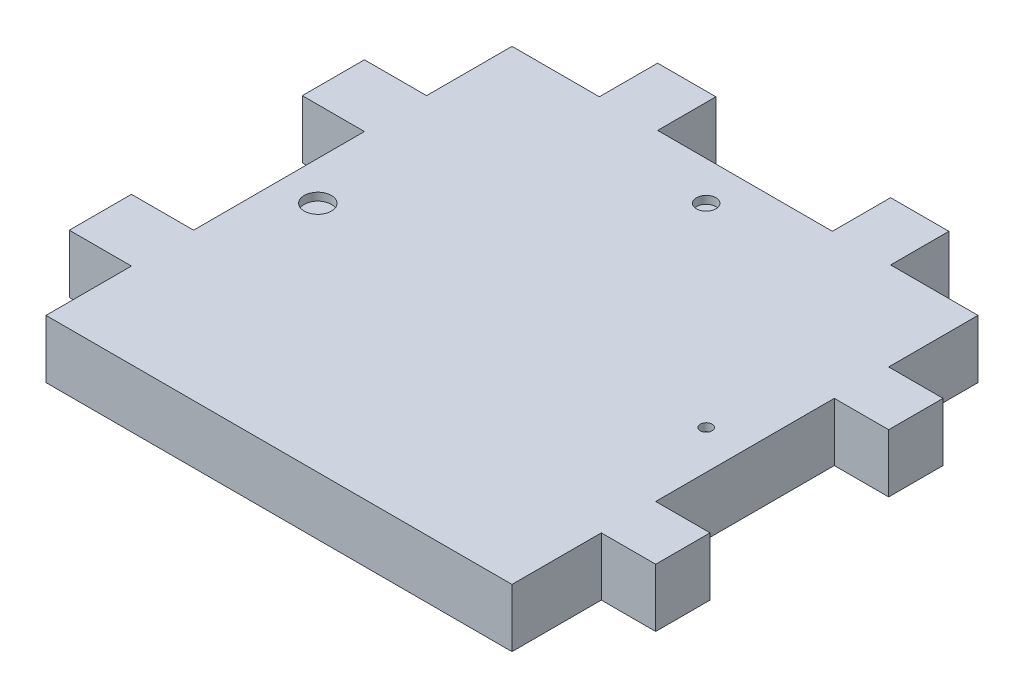
ISO-10303-21;
HEADER;
FILE_DESCRIPTION(('STEP AP214'),'2;1');
FILE_NAME('part.step','',(''),(''),'','','');
FILE_SCHEMA(('AUTOMOTIVE_DESIGN { 1 0 10303 214 1 1 1 1 }'));
ENDSEC;
DATA;
#1=APPLICATION_CONTEXT('core data for automotive mechanical design processes');
#2=APPLICATION_PROTOCOL_DEFINITION('international standard','automotive_design',2000,#1);
#3=PRODUCT_CONTEXT('',#1,'mechanical');
#4=PRODUCT('Part','Part','',(#3));
#5=PRODUCT_RELATED_PRODUCT_CATEGORY('part','',(#4));
#6=PRODUCT_DEFINITION_FORMATION('','',#4);
#7=PRODUCT_DEFINITION_CONTEXT('part definition',#1,'design');
#8=PRODUCT_DEFINITION('design','',#6,#7);
#9=PRODUCT_DEFINITION_SHAPE('','',#8);
#10=(LENGTH_UNIT() NAMED_UNIT(*) SI_UNIT(.MILLI.,.METRE.));
#11=(NAMED_UNIT(*) PLANE_ANGLE_UNIT() SI_UNIT($,.RADIAN.));
#12=(NAMED_UNIT(*) SI_UNIT($,.STERADIAN.) SOLID_ANGLE_UNIT());
#13=UNCERTAINTY_MEASURE_WITH_UNIT(LENGTH_MEASURE(1.E-05),#10,'distance_accuracy_value','');
#14=(GEOMETRIC_REPRESENTATION_CONTEXT(3) GLOBAL_UNCERTAINTY_ASSIGNED_CONTEXT((#13)) GLOBAL_UNIT_ASSIGNED_CONTEXT((#10,
#11,#12)) REPRESENTATION_CONTEXT('',''));
#15=CARTESIAN_POINT('',(0.,0.,0.));
#16=DIRECTION('',(0.,0.,1.));
#17=DIRECTION('',(1.,0.,0.));
#18=AXIS2_PLACEMENT_3D('',#15,#16,#17);
#19=CARTESIAN_POINT('',(0.,19.05,-76.1999999999998));
#20=DIRECTION('',(0.,0.,1.));
#21=DIRECTION('',(1.,0.,0.));
#22=AXIS2_PLACEMENT_3D('',#19,#20,#21);
#23=PLANE('',#22);
#24=DIRECTION('',(-1.,0.,0.));
#25=VECTOR('',#24,1.);
#26=CARTESIAN_POINT('',(0.,0.,-76.1999999999998));
#27=LINE('',#26,#25);
#28=CARTESIAN_POINT('',(76.1999999999998,0.,-76.1999999999998));
#29=VERTEX_POINT('',#28);
#30=CARTESIAN_POINT('',(47.625,0.,-76.1999999999998));
#31=VERTEX_POINT('',#30);
#32=EDGE_CURVE('E261',#29,#31,#27,.T.);
#33=ORIENTED_EDGE('',*,*,#32,.T.);
#34=DIRECTION('',(0.,-1.,0.));
#35=VECTOR('',#34,1.);
#36=CARTESIAN_POINT('',(47.625,19.05,-76.1999999999998));
#37=LINE('',#36,#35);
#38=CARTESIAN_POINT('',(47.625,19.05,-76.1999999999998));
#39=VERTEX_POINT('',#38);
#40=EDGE_CURVE('E11',#39,#31,#37,.T.);
#41=ORIENTED_EDGE('',*,*,#40,.F.);
#42=DIRECTION('',(-1.,0.,0.));
#43=VECTOR('',#42,1.);
#44=CARTESIAN_POINT('',(0.,19.05,-76.1999999999998));
#45=LINE('',#44,#43);
#46=CARTESIAN_POINT('',(76.1999999999998,19.05,-76.1999999999998));
#47=VERTEX_POINT('',#46);
#48=EDGE_CURVE('E400',#47,#39,#45,.T.);
#49=ORIENTED_EDGE('',*,*,#48,.F.);
#50=DIRECTION('',(0.,-1.,0.));
#51=VECTOR('',#50,1.);
#52=CARTESIAN_POINT('',(76.1999999999998,19.05,-76.1999999999998));
#53=LINE('',#52,#51);
#54=EDGE_CURVE('E58',#47,#29,#53,.T.);
#55=ORIENTED_EDGE('',*,*,#54,.T.);
#56=EDGE_LOOP('',(#33,#41,#49,#55));
#57=FACE_BOUND('',#56,.T.);
#58=ADVANCED_FACE('F41',(#57),#23,.F.);
#59=CARTESIAN_POINT('',(47.625,19.05,0.));
#60=DIRECTION('',(-1.,0.,0.));
#61=DIRECTION('',(0.,0.,1.));
#62=AXIS2_PLACEMENT_3D('',#59,#60,#61);
#63=PLANE('',#62);
#64=DIRECTION('',(0.,0.,-1.));
#65=VECTOR('',#64,1.);
#66=CARTESIAN_POINT('',(47.625,0.,0.));
#67=LINE('',#66,#65);
#68=CARTESIAN_POINT('',(47.625,0.,-95.2499999999998));
#69=VERTEX_POINT('',#68);
#70=EDGE_CURVE('E263',#31,#69,#67,.T.);
#71=ORIENTED_EDGE('',*,*,#70,.T.);
#72=DIRECTION('',(0.,-1.,0.));
#73=VECTOR('',#72,1.);
#74=CARTESIAN_POINT('',(47.625,19.05,-95.2499999999998));
#75=LINE('',#74,#73);
#76=CARTESIAN_POINT('',(47.625,19.05,-95.2499999999998));
#77=VERTEX_POINT('',#76);
#78=EDGE_CURVE('E50',#77,#69,#75,.T.);
#79=ORIENTED_EDGE('',*,*,#78,.F.);
#80=DIRECTION('',(0.,0.,-1.));
#81=VECTOR('',#80,1.);
#82=CARTESIAN_POINT('',(47.625,19.05,0.));
#83=LINE('',#82,#81);
#84=EDGE_CURVE('E156',#39,#77,#83,.T.);
#85=ORIENTED_EDGE('',*,*,#84,.F.);
#86=ORIENTED_EDGE('',*,*,#40,.T.);
#87=EDGE_LOOP('',(#71,#79,#85,#86));
#88=FACE_BOUND('',#87,.T.);
#89=ADVANCED_FACE('F43',(#88),#63,.F.);
#90=CARTESIAN_POINT('',(7.63278329429797E-13,19.05,-95.2500000000002));
#91=DIRECTION('',(0.,0.,-1.));
#92=DIRECTION('',(-1.,0.,0.));
#93=AXIS2_PLACEMENT_3D('',#90,#91,#92);
#94=PLANE('',#93);
#95=DIRECTION('',(1.,0.,0.));
#96=VECTOR('',#95,1.);
#97=CARTESIAN_POINT('',(7.63278329429797E-13,0.,-95.2500000000002));
#98=LINE('',#97,#96);
#99=CARTESIAN_POINT('',(28.575,0.,-95.25));
#100=VERTEX_POINT('',#99);
#101=EDGE_CURVE('E269',#100,#69,#98,.T.);
#102=ORIENTED_EDGE('',*,*,#101,.F.);
#103=DIRECTION('',(0.,-1.,0.));
#104=VECTOR('',#103,1.);
#105=CARTESIAN_POINT('',(28.575,19.05,-95.25));
#106=LINE('',#105,#104);
#107=CARTESIAN_POINT('',(28.575,19.05,-95.25));
#108=VERTEX_POINT('',#107);
#109=EDGE_CURVE('E378',#108,#100,#106,.T.);
#110=ORIENTED_EDGE('',*,*,#109,.F.);
#111=DIRECTION('',(1.,0.,0.));
#112=VECTOR('',#111,1.);
#113=CARTESIAN_POINT('',(7.63278329429797E-13,19.05,-95.2500000000002));
#114=LINE('',#113,#112);
#115=EDGE_CURVE('E384',#108,#77,#114,.T.);
#116=ORIENTED_EDGE('',*,*,#115,.T.);
#117=ORIENTED_EDGE('',*,*,#78,.T.);
#118=EDGE_LOOP('',(#102,#110,#116,#117));
#119=FACE_BOUND('',#118,.T.);
#120=ADVANCED_FACE('F382',(#119),#94,.T.);
#121=CARTESIAN_POINT('',(28.575,19.05,0.));
#122=DIRECTION('',(-1.,0.,0.));
#123=DIRECTION('',(0.,0.,1.));
#124=AXIS2_PLACEMENT_3D('',#121,#122,#123);
#125=PLANE('',#124);
#126=DIRECTION('',(0.,0.,-1.));
#127=VECTOR('',#126,1.);
#128=CARTESIAN_POINT('',(28.575,0.,0.));
#129=LINE('',#128,#127);
#130=CARTESIAN_POINT('',(28.575,0.,-76.1999999999998));
#131=VERTEX_POINT('',#130);
#132=EDGE_CURVE('E272',#131,#100,#129,.T.);
#133=ORIENTED_EDGE('',*,*,#132,.F.);
#134=DIRECTION('',(0.,-1.,0.));
#135=VECTOR('',#134,1.);
#136=CARTESIAN_POINT('',(28.575,19.05,-76.1999999999998));
#137=LINE('',#136,#135);
#138=CARTESIAN_POINT('',(28.575,19.05,-76.1999999999998));
#139=VERTEX_POINT('',#138);
#140=EDGE_CURVE('E376',#139,#131,#137,.T.);
#141=ORIENTED_EDGE('',*,*,#140,.F.);
#142=DIRECTION('',(0.,0.,-1.));
#143=VECTOR('',#142,1.);
#144=CARTESIAN_POINT('',(28.575,19.05,0.));
#145=LINE('',#144,#143);
#146=EDGE_CURVE('E396',#139,#108,#145,.T.);
#147=ORIENTED_EDGE('',*,*,#146,.T.);
#148=ORIENTED_EDGE('',*,*,#109,.T.);
#149=EDGE_LOOP('',(#133,#141,#147,#148));
#150=FACE_BOUND('',#149,.T.);
#151=ADVANCED_FACE('F392',(#150),#125,.T.);
#152=CARTESIAN_POINT('',(-28.575,0.,-76.1999999999998));
#153=VERTEX_POINT('',#152);
#154=EDGE_CURVE('E266',#131,#153,#27,.T.);
#155=ORIENTED_EDGE('',*,*,#154,.T.);
#156=DIRECTION('',(0.,-1.,0.));
#157=VECTOR('',#156,1.);
#158=CARTESIAN_POINT('',(-28.575,19.05,-76.1999999999998));
#159=LINE('',#158,#157);
#160=CARTESIAN_POINT('',(-28.575,19.05,-76.1999999999998));
#161=VERTEX_POINT('',#160);
#162=EDGE_CURVE('E373',#161,#153,#159,.T.);
#163=ORIENTED_EDGE('',*,*,#162,.F.);
#164=EDGE_CURVE('E398',#139,#161,#45,.T.);
#165=ORIENTED_EDGE('',*,*,#164,.F.);
#166=ORIENTED_EDGE('',*,*,#140,.T.);
#167=EDGE_LOOP('',(#155,#163,#165,#166));
#168=FACE_BOUND('',#167,.T.);
#169=ADVANCED_FACE('F461',(#168),#23,.F.);
#170=CARTESIAN_POINT('',(-28.575,19.05,0.));
#171=DIRECTION('',(-1.,0.,0.));
#172=DIRECTION('',(0.,0.,1.));
#173=AXIS2_PLACEMENT_3D('',#170,#171,#172);
#174=PLANE('',#173);
#175=DIRECTION('',(0.,0.,-1.));
#176=VECTOR('',#175,1.);
#177=CARTESIAN_POINT('',(-28.575,0.,0.));
#178=LINE('',#177,#176);
#179=CARTESIAN_POINT('',(-28.575,0.,-95.25));
#180=VERTEX_POINT('',#179);
#181=EDGE_CURVE('E275',#153,#180,#178,.T.);
#182=ORIENTED_EDGE('',*,*,#181,.T.);
#183=DIRECTION('',(0.,-1.,0.));
#184=VECTOR('',#183,1.);
#185=CARTESIAN_POINT('',(-28.575,19.05,-95.25));
#186=LINE('',#185,#184);
#187=CARTESIAN_POINT('',(-28.575,19.05,-95.25));
#188=VERTEX_POINT('',#187);
#189=EDGE_CURVE('E371',#188,#180,#186,.T.);
#190=ORIENTED_EDGE('',*,*,#189,.F.);
#191=DIRECTION('',(0.,0.,-1.));
#192=VECTOR('',#191,1.);
#193=CARTESIAN_POINT('',(-28.575,19.05,0.));
#194=LINE('',#193,#192);
#195=EDGE_CURVE('E404',#161,#188,#194,.T.);
#196=ORIENTED_EDGE('',*,*,#195,.F.);
#197=ORIENTED_EDGE('',*,*,#162,.T.);
#198=EDGE_LOOP('',(#182,#190,#196,#197));
#199=FACE_BOUND('',#198,.T.);
#200=ADVANCED_FACE('F463',(#199),#174,.F.);
#201=CARTESIAN_POINT('',(-7.63278329429797E-13,19.05,-95.2500000000002));
#202=DIRECTION('',(0.,0.,-1.));
#203=DIRECTION('',(-1.,0.,0.));
#204=AXIS2_PLACEMENT_3D('',#201,#202,#203);
#205=PLANE('',#204);
#206=DIRECTION('',(1.,0.,0.));
#207=VECTOR('',#206,1.);
#208=CARTESIAN_POINT('',(-7.63278329429797E-13,0.,-95.2500000000002));
#209=LINE('',#208,#207);
#210=CARTESIAN_POINT('',(-47.625,0.,-95.2499999999998));
#211=VERTEX_POINT('',#210);
#212=EDGE_CURVE('E278',#211,#180,#209,.T.);
#213=ORIENTED_EDGE('',*,*,#212,.F.);
#214=DIRECTION('',(0.,-1.,0.));
#215=VECTOR('',#214,1.);
#216=CARTESIAN_POINT('',(-47.625,19.05,-95.2499999999998));
#217=LINE('',#216,#215);
#218=CARTESIAN_POINT('',(-47.625,19.05,-95.2499999999998));
#219=VERTEX_POINT('',#218);
#220=EDGE_CURVE('E369',#219,#211,#217,.T.);
#221=ORIENTED_EDGE('',*,*,#220,.F.);
#222=DIRECTION('',(1.,0.,0.));
#223=VECTOR('',#222,1.);
#224=CARTESIAN_POINT('',(-7.63278329429797E-13,19.05,-95.2500000000002));
#225=LINE('',#224,#223);
#226=EDGE_CURVE('E406',#219,#188,#225,.T.);
#227=ORIENTED_EDGE('',*,*,#226,.T.);
#228=ORIENTED_EDGE('',*,*,#189,.T.);
#229=EDGE_LOOP('',(#213,#221,#227,#228));
#230=FACE_BOUND('',#229,.T.);
#231=ADVANCED_FACE('F466',(#230),#205,.T.);
#232=CARTESIAN_POINT('',(-47.625,19.05,0.));
#233=DIRECTION('',(-1.,0.,0.));
#234=DIRECTION('',(0.,0.,1.));
#235=AXIS2_PLACEMENT_3D('',#232,#233,#234);
#236=PLANE('',#235);
#237=DIRECTION('',(0.,0.,-1.));
#238=VECTOR('',#237,1.);
#239=CARTESIAN_POINT('',(-47.625,0.,0.));
#240=LINE('',#239,#238);
#241=CARTESIAN_POINT('',(-47.625,0.,-76.1999999999998));
#242=VERTEX_POINT('',#241);
#243=EDGE_CURVE('E281',#242,#211,#240,.T.);
#244=ORIENTED_EDGE('',*,*,#243,.F.);
#245=DIRECTION('',(0.,-1.,0.));
#246=VECTOR('',#245,1.);
#247=CARTESIAN_POINT('',(-47.625,19.05,-76.1999999999998));
#248=LINE('',#247,#246);
#249=CARTESIAN_POINT('',(-47.625,19.05,-76.1999999999998));
#250=VERTEX_POINT('',#249);
#251=EDGE_CURVE('E367',#250,#242,#248,.T.);
#252=ORIENTED_EDGE('',*,*,#251,.F.);
#253=DIRECTION('',(0.,0.,-1.));
#254=VECTOR('',#253,1.);
#255=CARTESIAN_POINT('',(-47.625,19.05,0.));
#256=LINE('',#255,#254);
#257=EDGE_CURVE('E409',#250,#219,#256,.T.);
#258=ORIENTED_EDGE('',*,*,#257,.T.);
#259=ORIENTED_EDGE('',*,*,#220,.T.);
#260=EDGE_LOOP('',(#244,#252,#258,#259));
#261=FACE_BOUND('',#260,.T.);
#262=ADVANCED_FACE('F470',(#261),#236,.T.);
#263=CARTESIAN_POINT('',(-76.2000000000002,0.,-76.1999999999998));
#264=VERTEX_POINT('',#263);
#265=EDGE_CURVE('E265',#242,#264,#27,.T.);
#266=ORIENTED_EDGE('',*,*,#265,.T.);
#267=DIRECTION('',(0.,-1.,0.));
#268=VECTOR('',#267,1.);
#269=CARTESIAN_POINT('',(-76.2000000000002,19.05,-76.1999999999998));
#270=LINE('',#269,#268);
#271=CARTESIAN_POINT('',(-76.2000000000002,19.05,-76.1999999999998));
#272=VERTEX_POINT('',#271);
#273=EDGE_CURVE('E364',#272,#264,#270,.T.);
#274=ORIENTED_EDGE('',*,*,#273,.F.);
#275=EDGE_CURVE('E412',#250,#272,#45,.T.);
#276=ORIENTED_EDGE('',*,*,#275,.F.);
#277=ORIENTED_EDGE('',*,*,#251,.T.);
#278=EDGE_LOOP('',(#266,#274,#276,#277));
#279=FACE_BOUND('',#278,.T.);
#280=ADVANCED_FACE('F475',(#279),#23,.F.);
#281=CARTESIAN_POINT('',(-76.2000000000002,19.05,0.));
#282=DIRECTION('',(1.,0.,0.));
#283=DIRECTION('',(0.,0.,-1.));
#284=AXIS2_PLACEMENT_3D('',#281,#282,#283);
#285=PLANE('',#284);
#286=DIRECTION('',(0.,0.,1.));
#287=VECTOR('',#286,1.);
#288=CARTESIAN_POINT('',(-76.2000000000002,0.,0.));
#289=LINE('',#288,#287);
#290=CARTESIAN_POINT('',(-76.2000000000002,0.,-48.26));
#291=VERTEX_POINT('',#290);
#292=EDGE_CURVE('E284',#264,#291,#289,.T.);
#293=ORIENTED_EDGE('',*,*,#292,.T.);
#294=DIRECTION('',(0.,-1.,0.));
#295=VECTOR('',#294,1.);
#296=CARTESIAN_POINT('',(-76.2000000000002,19.05,-48.26));
#297=LINE('',#296,#295);
#298=CARTESIAN_POINT('',(-76.2000000000002,19.05,-48.26));
#299=VERTEX_POINT('',#298);
#300=EDGE_CURVE('E361',#299,#291,#297,.T.);
#301=ORIENTED_EDGE('',*,*,#300,.F.);
#302=DIRECTION('',(0.,0.,1.));
#303=VECTOR('',#302,1.);
#304=CARTESIAN_POINT('',(-76.2000000000002,19.05,0.));
#305=LINE('',#304,#303);
#306=EDGE_CURVE('E413',#272,#299,#305,.T.);
#307=ORIENTED_EDGE('',*,*,#306,.F.);
#308=ORIENTED_EDGE('',*,*,#273,.T.);
#309=EDGE_LOOP('',(#293,#301,#307,#308));
#310=FACE_BOUND('',#309,.T.);
#311=ADVANCED_FACE('F481',(#310),#285,.F.);
#312=CARTESIAN_POINT('',(0.,19.05,-48.26));
#313=DIRECTION('',(0.,0.,1.));
#314=DIRECTION('',(1.,0.,0.));
#315=AXIS2_PLACEMENT_3D('',#312,#313,#314);
#316=PLANE('',#315);
#317=DIRECTION('',(-1.,0.,0.));
#318=VECTOR('',#317,1.);
#319=CARTESIAN_POINT('',(0.,0.,-48.26));
#320=LINE('',#319,#318);
#321=CARTESIAN_POINT('',(-96.52,0.,-48.26));
#322=VERTEX_POINT('',#321);
#323=EDGE_CURVE('E286',#291,#322,#320,.T.);
#324=ORIENTED_EDGE('',*,*,#323,.T.);
#325=DIRECTION('',(0.,-1.,0.));
#326=VECTOR('',#325,1.);
#327=CARTESIAN_POINT('',(-96.52,19.05,-48.26));
#328=LINE('',#327,#326);
#329=CARTESIAN_POINT('',(-96.52,19.05,-48.26));
#330=VERTEX_POINT('',#329);
#331=EDGE_CURVE('E358',#330,#322,#328,.T.);
#332=ORIENTED_EDGE('',*,*,#331,.F.);
#333=DIRECTION('',(-1.,0.,0.));
#334=VECTOR('',#333,1.);
#335=CARTESIAN_POINT('',(0.,19.05,-48.26));
#336=LINE('',#335,#334);
#337=EDGE_CURVE('E415',#299,#330,#336,.T.);
#338=ORIENTED_EDGE('',*,*,#337,.F.);
#339=ORIENTED_EDGE('',*,*,#300,.T.);
#340=EDGE_LOOP('',(#324,#332,#338,#339));
#341=FACE_BOUND('',#340,.T.);
#342=ADVANCED_FACE('F485',(#341),#316,.F.);
#343=CARTESIAN_POINT('',(-96.52,19.05,0.));
#344=DIRECTION('',(1.,0.,0.));
#345=DIRECTION('',(0.,0.,-1.));
#346=AXIS2_PLACEMENT_3D('',#343,#344,#345);
#347=PLANE('',#346);
#348=DIRECTION('',(0.,0.,1.));
#349=VECTOR('',#348,1.);
#350=CARTESIAN_POINT('',(-96.52,0.,0.));
#351=LINE('',#350,#349);
#352=CARTESIAN_POINT('',(-96.52,0.,-27.94));
#353=VERTEX_POINT('',#352);
#354=EDGE_CURVE('E290',#322,#353,#351,.T.);
#355=ORIENTED_EDGE('',*,*,#354,.T.);
#356=DIRECTION('',(0.,-1.,0.));
#357=VECTOR('',#356,1.);
#358=CARTESIAN_POINT('',(-96.52,19.05,-27.94));
#359=LINE('',#358,#357);
#360=CARTESIAN_POINT('',(-96.52,19.05,-27.94));
#361=VERTEX_POINT('',#360);
#362=EDGE_CURVE('E356',#361,#353,#359,.T.);
#363=ORIENTED_EDGE('',*,*,#362,.F.);
#364=DIRECTION('',(0.,0.,1.));
#365=VECTOR('',#364,1.);
#366=CARTESIAN_POINT('',(-96.52,19.05,0.));
#367=LINE('',#366,#365);
#368=EDGE_CURVE('E419',#330,#361,#367,.T.);
#369=ORIENTED_EDGE('',*,*,#368,.F.);
#370=ORIENTED_EDGE('',*,*,#331,.T.);
#371=EDGE_LOOP('',(#355,#363,#369,#370));
#372=FACE_BOUND('',#371,.T.);
#373=ADVANCED_FACE('F490',(#372),#347,.F.);
#374=CARTESIAN_POINT('',(0.,19.05,-27.94));
#375=DIRECTION('',(0.,0.,1.));
#376=DIRECTION('',(1.,0.,0.));
#377=AXIS2_PLACEMENT_3D('',#374,#375,#376);
#378=PLANE('',#377);
#379=DIRECTION('',(-1.,0.,0.));
#380=VECTOR('',#379,1.);
#381=CARTESIAN_POINT('',(0.,0.,-27.94));
#382=LINE('',#381,#380);
#383=CARTESIAN_POINT('',(-76.2000000000002,0.,-27.94));
#384=VERTEX_POINT('',#383);
#385=EDGE_CURVE('E293',#384,#353,#382,.T.);
#386=ORIENTED_EDGE('',*,*,#385,.F.);
#387=DIRECTION('',(0.,-1.,0.));
#388=VECTOR('',#387,1.);
#389=CARTESIAN_POINT('',(-76.2000000000002,19.05,-27.94));
#390=LINE('',#389,#388);
#391=CARTESIAN_POINT('',(-76.2000000000002,19.05,-27.94));
#392=VERTEX_POINT('',#391);
#393=EDGE_CURVE('E354',#392,#384,#390,.T.);
#394=ORIENTED_EDGE('',*,*,#393,.F.);
#395=DIRECTION('',(-1.,0.,0.));
#396=VECTOR('',#395,1.);
#397=CARTESIAN_POINT('',(0.,19.05,-27.94));
#398=LINE('',#397,#396);
#399=EDGE_CURVE('E421',#392,#361,#398,.T.);
#400=ORIENTED_EDGE('',*,*,#399,.T.);
#401=ORIENTED_EDGE('',*,*,#362,.T.);
#402=EDGE_LOOP('',(#386,#394,#400,#401));
#403=FACE_BOUND('',#402,.T.);
#404=ADVANCED_FACE('F496',(#403),#378,.T.);
#405=CARTESIAN_POINT('',(-76.2000000000002,0.,27.94));
#406=VERTEX_POINT('',#405);
#407=EDGE_CURVE('E288',#384,#406,#289,.T.);
#408=ORIENTED_EDGE('',*,*,#407,.T.);
#409=DIRECTION('',(0.,-1.,0.));
#410=VECTOR('',#409,1.);
#411=CARTESIAN_POINT('',(-76.2000000000002,19.05,27.94));
#412=LINE('',#411,#410);
#413=CARTESIAN_POINT('',(-76.2000000000002,19.05,27.94));
#414=VERTEX_POINT('',#413);
#415=EDGE_CURVE('E351',#414,#406,#412,.T.);
#416=ORIENTED_EDGE('',*,*,#415,.F.);
#417=EDGE_CURVE('E417',#392,#414,#305,.T.);
#418=ORIENTED_EDGE('',*,*,#417,.F.);
#419=ORIENTED_EDGE('',*,*,#393,.T.);
#420=EDGE_LOOP('',(#408,#416,#418,#419));
#421=FACE_BOUND('',#420,.T.);
#422=ADVANCED_FACE('F499',(#421),#285,.F.);
#423=CARTESIAN_POINT('',(0.,19.05,27.94));
#424=DIRECTION('',(0.,0.,1.));
#425=DIRECTION('',(1.,0.,0.));
#426=AXIS2_PLACEMENT_3D('',#423,#424,#425);
#427=PLANE('',#426);
#428=DIRECTION('',(-1.,0.,0.));
#429=VECTOR('',#428,1.);
#430=CARTESIAN_POINT('',(0.,0.,27.94));
#431=LINE('',#430,#429);
#432=CARTESIAN_POINT('',(-96.52,0.,27.94));
#433=VERTEX_POINT('',#432);
#434=EDGE_CURVE('E296',#406,#433,#431,.T.);
#435=ORIENTED_EDGE('',*,*,#434,.T.);
#436=DIRECTION('',(0.,-1.,0.));
#437=VECTOR('',#436,1.);
#438=CARTESIAN_POINT('',(-96.52,19.05,27.94));
#439=LINE('',#438,#437);
#440=CARTESIAN_POINT('',(-96.52,19.05,27.94));
#441=VERTEX_POINT('',#440);
#442=EDGE_CURVE('E348',#441,#433,#439,.T.);
#443=ORIENTED_EDGE('',*,*,#442,.F.);
#444=DIRECTION('',(-1.,0.,0.));
#445=VECTOR('',#444,1.);
#446=CARTESIAN_POINT('',(0.,19.05,27.94));
#447=LINE('',#446,#445);
#448=EDGE_CURVE('E424',#414,#441,#447,.T.);
#449=ORIENTED_EDGE('',*,*,#448,.F.);
#450=ORIENTED_EDGE('',*,*,#415,.T.);
#451=EDGE_LOOP('',(#435,#443,#449,#450));
#452=FACE_BOUND('',#451,.T.);
#453=ADVANCED_FACE('F534',(#452),#427,.F.);
#454=CARTESIAN_POINT('',(-96.52,19.05,0.));
#455=DIRECTION('',(1.,0.,0.));
#456=DIRECTION('',(0.,0.,-1.));
#457=AXIS2_PLACEMENT_3D('',#454,#455,#456);
#458=PLANE('',#457);
#459=DIRECTION('',(0.,0.,1.));
#460=VECTOR('',#459,1.);
#461=CARTESIAN_POINT('',(-96.52,0.,0.));
#462=LINE('',#461,#460);
#463=CARTESIAN_POINT('',(-96.52,0.,48.26));
#464=VERTEX_POINT('',#463);
#465=EDGE_CURVE('E298',#433,#464,#462,.T.);
#466=ORIENTED_EDGE('',*,*,#465,.T.);
#467=DIRECTION('',(0.,-1.,0.));
#468=VECTOR('',#467,1.);
#469=CARTESIAN_POINT('',(-96.52,19.05,48.26));
#470=LINE('',#469,#468);
#471=CARTESIAN_POINT('',(-96.52,19.05,48.26));
#472=VERTEX_POINT('',#471);
#473=EDGE_CURVE('E346',#472,#464,#470,.T.);
#474=ORIENTED_EDGE('',*,*,#473,.F.);
#475=DIRECTION('',(0.,0.,1.));
#476=VECTOR('',#475,1.);
#477=CARTESIAN_POINT('',(-96.52,19.05,0.));
#478=LINE('',#477,#476);
#479=EDGE_CURVE('E426',#441,#472,#478,.T.);
#480=ORIENTED_EDGE('',*,*,#479,.F.);
#481=ORIENTED_EDGE('',*,*,#442,.T.);
#482=EDGE_LOOP('',(#466,#474,#480,#481));
#483=FACE_BOUND('',#482,.T.);
#484=ADVANCED_FACE('F530',(#483),#458,.F.);
#485=CARTESIAN_POINT('',(0.,19.05,48.26));
#486=DIRECTION('',(0.,0.,1.));
#487=DIRECTION('',(1.,0.,0.));
#488=AXIS2_PLACEMENT_3D('',#485,#486,#487);
#489=PLANE('',#488);
#490=DIRECTION('',(-1.,0.,0.));
#491=VECTOR('',#490,1.);
#492=CARTESIAN_POINT('',(0.,0.,48.26));
#493=LINE('',#492,#491);
#494=CARTESIAN_POINT('',(-76.2000000000001,0.,48.26));
#495=VERTEX_POINT('',#494);
#496=EDGE_CURVE('E301',#495,#464,#493,.T.);
#497=ORIENTED_EDGE('',*,*,#496,.F.);
#498=DIRECTION('',(0.,-1.,0.));
#499=VECTOR('',#498,1.);
#500=CARTESIAN_POINT('',(-76.2000000000001,19.05,48.26));
#501=LINE('',#500,#499);
#502=CARTESIAN_POINT('',(-76.2000000000001,19.05,48.26));
#503=VERTEX_POINT('',#502);
#504=EDGE_CURVE('E344',#503,#495,#501,.T.);
#505=ORIENTED_EDGE('',*,*,#504,.F.);
#506=DIRECTION('',(-1.,0.,0.));
#507=VECTOR('',#506,1.);
#508=CARTESIAN_POINT('',(0.,19.05,48.26));
#509=LINE('',#508,#507);
#510=EDGE_CURVE('E428',#503,#472,#509,.T.);
#511=ORIENTED_EDGE('',*,*,#510,.T.);
#512=ORIENTED_EDGE('',*,*,#473,.T.);
#513=EDGE_LOOP('',(#497,#505,#511,#512));
#514=FACE_BOUND('',#513,.T.);
#515=ADVANCED_FACE('F526',(#514),#489,.T.);
#516=CARTESIAN_POINT('',(-76.2000000000001,0.,76.2));
#517=VERTEX_POINT('',#516);
#518=EDGE_CURVE('E287',#495,#517,#289,.T.);
#519=ORIENTED_EDGE('',*,*,#518,.T.);
#520=DIRECTION('',(0.,-1.,0.));
#521=VECTOR('',#520,1.);
#522=CARTESIAN_POINT('',(-76.2000000000001,19.05,76.2));
#523=LINE('',#522,#521);
#524=CARTESIAN_POINT('',(-76.2000000000001,19.05,76.2));
#525=VERTEX_POINT('',#524);
#526=EDGE_CURVE('E342',#525,#517,#523,.T.);
#527=ORIENTED_EDGE('',*,*,#526,.F.);
#528=EDGE_CURVE('E416',#503,#525,#305,.T.);
#529=ORIENTED_EDGE('',*,*,#528,.F.);
#530=ORIENTED_EDGE('',*,*,#504,.T.);
#531=EDGE_LOOP('',(#519,#527,#529,#530));
#532=FACE_BOUND('',#531,.T.);
#533=ADVANCED_FACE('F508',(#532),#285,.F.);
#534=CARTESIAN_POINT('',(0.,19.05,76.2));
#535=DIRECTION('',(0.,0.,1.));
#536=DIRECTION('',(1.,0.,0.));
#537=AXIS2_PLACEMENT_3D('',#534,#535,#536);
#538=PLANE('',#537);
#539=DIRECTION('',(-1.,0.,0.));
#540=VECTOR('',#539,1.);
#541=CARTESIAN_POINT('',(0.,0.,76.2));
#542=LINE('',#541,#540);
#543=CARTESIAN_POINT('',(76.1999999999998,0.,76.2));
#544=VERTEX_POINT('',#543);
#545=EDGE_CURVE('E304',#544,#517,#542,.T.);
#546=ORIENTED_EDGE('',*,*,#545,.F.);
#547=DIRECTION('',(0.,-1.,0.));
#548=VECTOR('',#547,1.);
#549=CARTESIAN_POINT('',(76.1999999999998,19.05,76.2));
#550=LINE('',#549,#548);
#551=CARTESIAN_POINT('',(76.1999999999998,19.05,76.2));
#552=VERTEX_POINT('',#551);
#553=EDGE_CURVE('E340',#552,#544,#550,.T.);
#554=ORIENTED_EDGE('',*,*,#553,.F.);
#555=DIRECTION('',(-1.,0.,0.));
#556=VECTOR('',#555,1.);
#557=CARTESIAN_POINT('',(0.,19.05,76.2));
#558=LINE('',#557,#556);
#559=EDGE_CURVE('E431',#552,#525,#558,.T.);
#560=ORIENTED_EDGE('',*,*,#559,.T.);
#561=ORIENTED_EDGE('',*,*,#526,.T.);
#562=EDGE_LOOP('',(#546,#554,#560,#561));
#563=FACE_BOUND('',#562,.T.);
#564=ADVANCED_FACE('F512',(#563),#538,.T.);
#565=CARTESIAN_POINT('',(76.1999999999998,19.05,0.));
#566=DIRECTION('',(1.,0.,0.));
#567=DIRECTION('',(0.,0.,-1.));
#568=AXIS2_PLACEMENT_3D('',#565,#566,#567);
#569=PLANE('',#568);
#570=DIRECTION('',(0.,0.,1.));
#571=VECTOR('',#570,1.);
#572=CARTESIAN_POINT('',(76.1999999999998,0.,0.));
#573=LINE('',#572,#571);
#574=CARTESIAN_POINT('',(76.1999999999998,0.,46.99));
#575=VERTEX_POINT('',#574);
#576=EDGE_CURVE('E307',#575,#544,#573,.T.);
#577=ORIENTED_EDGE('',*,*,#576,.F.);
#578=DIRECTION('',(0.,-1.,0.));
#579=VECTOR('',#578,1.);
#580=CARTESIAN_POINT('',(76.1999999999998,19.05,46.99));
#581=LINE('',#580,#579);
#582=CARTESIAN_POINT('',(76.1999999999998,19.05,46.99));
#583=VERTEX_POINT('',#582);
#584=EDGE_CURVE('E338',#583,#575,#581,.T.);
#585=ORIENTED_EDGE('',*,*,#584,.F.);
#586=DIRECTION('',(0.,0.,1.));
#587=VECTOR('',#586,1.);
#588=CARTESIAN_POINT('',(76.1999999999998,19.05,0.));
#589=LINE('',#588,#587);
#590=EDGE_CURVE('E258',#583,#552,#589,.T.);
#591=ORIENTED_EDGE('',*,*,#590,.T.);
#592=ORIENTED_EDGE('',*,*,#553,.T.);
#593=EDGE_LOOP('',(#577,#585,#591,#592));
#594=FACE_BOUND('',#593,.T.);
#595=ADVANCED_FACE('F515',(#594),#569,.T.);
#596=CARTESIAN_POINT('',(0.,19.05,46.99));
#597=DIRECTION('',(0.,0.,-1.));
#598=DIRECTION('',(-1.,0.,0.));
#599=AXIS2_PLACEMENT_3D('',#596,#597,#598);
#600=PLANE('',#599);
#601=DIRECTION('',(1.,0.,0.));
#602=VECTOR('',#601,1.);
#603=CARTESIAN_POINT('',(0.,0.,46.99));
#604=LINE('',#603,#602);
#605=CARTESIAN_POINT('',(93.98,0.,46.99));
#606=VERTEX_POINT('',#605);
#607=EDGE_CURVE('E310',#575,#606,#604,.T.);
#608=ORIENTED_EDGE('',*,*,#607,.T.);
#609=DIRECTION('',(0.,-1.,0.));
#610=VECTOR('',#609,1.);
#611=CARTESIAN_POINT('',(93.98,19.05,46.99));
#612=LINE('',#611,#610);
#613=CARTESIAN_POINT('',(93.98,19.05,46.99));
#614=VERTEX_POINT('',#613);
#615=EDGE_CURVE('E336',#614,#606,#612,.T.);
#616=ORIENTED_EDGE('',*,*,#615,.F.);
#617=DIRECTION('',(1.,0.,0.));
#618=VECTOR('',#617,1.);
#619=CARTESIAN_POINT('',(0.,19.05,46.99));
#620=LINE('',#619,#618);
#621=EDGE_CURVE('E435',#583,#614,#620,.T.);
#622=ORIENTED_EDGE('',*,*,#621,.F.);
#623=ORIENTED_EDGE('',*,*,#584,.T.);
#624=EDGE_LOOP('',(#608,#616,#622,#623));
#625=FACE_BOUND('',#624,.T.);
#626=ADVANCED_FACE('F519',(#625),#600,.F.);
#627=CARTESIAN_POINT('',(93.98,19.05,0.));
#628=DIRECTION('',(1.,0.,0.));
#629=DIRECTION('',(0.,0.,-1.));
#630=AXIS2_PLACEMENT_3D('',#627,#628,#629);
#631=PLANE('',#630);
#632=DIRECTION('',(0.,0.,1.));
#633=VECTOR('',#632,1.);
#634=CARTESIAN_POINT('',(93.98,0.,0.));
#635=LINE('',#634,#633);
#636=CARTESIAN_POINT('',(93.98,0.,29.21));
#637=VERTEX_POINT('',#636);
#638=EDGE_CURVE('E315',#637,#606,#635,.T.);
#639=ORIENTED_EDGE('',*,*,#638,.F.);
#640=DIRECTION('',(0.,-1.,0.));
#641=VECTOR('',#640,1.);
#642=CARTESIAN_POINT('',(93.98,19.05,29.21));
#643=LINE('',#642,#641);
#644=CARTESIAN_POINT('',(93.98,19.05,29.21));
#645=VERTEX_POINT('',#644);
#646=EDGE_CURVE('E334',#645,#637,#643,.T.);
#647=ORIENTED_EDGE('',*,*,#646,.F.);
#648=DIRECTION('',(0.,0.,1.));
#649=VECTOR('',#648,1.);
#650=CARTESIAN_POINT('',(93.98,19.05,0.));
#651=LINE('',#650,#649);
#652=EDGE_CURVE('E437',#645,#614,#651,.T.);
#653=ORIENTED_EDGE('',*,*,#652,.T.);
#654=ORIENTED_EDGE('',*,*,#615,.T.);
#655=EDGE_LOOP('',(#639,#647,#653,#654));
#656=FACE_BOUND('',#655,.T.);
#657=ADVANCED_FACE('F522',(#656),#631,.T.);
#658=CARTESIAN_POINT('',(0.,19.05,29.21));
#659=DIRECTION('',(0.,0.,-1.));
#660=DIRECTION('',(-1.,0.,0.));
#661=AXIS2_PLACEMENT_3D('',#658,#659,#660);
#662=PLANE('',#661);
#663=DIRECTION('',(1.,0.,0.));
#664=VECTOR('',#663,1.);
#665=CARTESIAN_POINT('',(0.,0.,29.21));
#666=LINE('',#665,#664);
#667=CARTESIAN_POINT('',(76.1999999999998,0.,29.21));
#668=VERTEX_POINT('',#667);
#669=EDGE_CURVE('E318',#668,#637,#666,.T.);
#670=ORIENTED_EDGE('',*,*,#669,.F.);
#671=DIRECTION('',(0.,-1.,0.));
#672=VECTOR('',#671,1.);
#673=CARTESIAN_POINT('',(76.1999999999998,19.05,29.21));
#674=LINE('',#673,#672);
#675=CARTESIAN_POINT('',(76.1999999999998,19.05,29.21));
#676=VERTEX_POINT('',#675);
#677=EDGE_CURVE('E332',#676,#668,#674,.T.);
#678=ORIENTED_EDGE('',*,*,#677,.F.);
#679=DIRECTION('',(1.,0.,0.));
#680=VECTOR('',#679,1.);
#681=CARTESIAN_POINT('',(0.,19.05,29.21));
#682=LINE('',#681,#680);
#683=EDGE_CURVE('E440',#676,#645,#682,.T.);
#684=ORIENTED_EDGE('',*,*,#683,.T.);
#685=ORIENTED_EDGE('',*,*,#646,.T.);
#686=EDGE_LOOP('',(#670,#678,#684,#685));
#687=FACE_BOUND('',#686,.T.);
#688=ADVANCED_FACE('F450',(#687),#662,.T.);
#689=CARTESIAN_POINT('',(76.1999999999998,0.,-29.21));
#690=VERTEX_POINT('',#689);
#691=EDGE_CURVE('E312',#690,#668,#573,.T.);
#692=ORIENTED_EDGE('',*,*,#691,.F.);
#693=DIRECTION('',(0.,-1.,0.));
#694=VECTOR('',#693,1.);
#695=CARTESIAN_POINT('',(76.1999999999998,19.05,-29.21));
#696=LINE('',#695,#694);
#697=CARTESIAN_POINT('',(76.1999999999998,19.05,-29.21));
#698=VERTEX_POINT('',#697);
#699=EDGE_CURVE('E330',#698,#690,#696,.T.);
#700=ORIENTED_EDGE('',*,*,#699,.F.);
#701=EDGE_CURVE('E257',#698,#676,#589,.T.);
#702=ORIENTED_EDGE('',*,*,#701,.T.);
#703=ORIENTED_EDGE('',*,*,#677,.T.);
#704=EDGE_LOOP('',(#692,#700,#702,#703));
#705=FACE_BOUND('',#704,.T.);
#706=ADVANCED_FACE('F445',(#705),#569,.T.);
#707=CARTESIAN_POINT('',(0.,19.05,-29.21));
#708=DIRECTION('',(0.,0.,-1.));
#709=DIRECTION('',(-1.,0.,0.));
#710=AXIS2_PLACEMENT_3D('',#707,#708,#709);
#711=PLANE('',#710);
#712=DIRECTION('',(1.,0.,0.));
#713=VECTOR('',#712,1.);
#714=CARTESIAN_POINT('',(0.,0.,-29.21));
#715=LINE('',#714,#713);
#716=CARTESIAN_POINT('',(93.98,0.,-29.21));
#717=VERTEX_POINT('',#716);
#718=EDGE_CURVE('E321',#690,#717,#715,.T.);
#719=ORIENTED_EDGE('',*,*,#718,.T.);
#720=DIRECTION('',(0.,-1.,0.));
#721=VECTOR('',#720,1.);
#722=CARTESIAN_POINT('',(93.98,19.05,-29.21));
#723=LINE('',#722,#721);
#724=CARTESIAN_POINT('',(93.98,19.05,-29.21));
#725=VERTEX_POINT('',#724);
#726=EDGE_CURVE('E241',#725,#717,#723,.T.);
#727=ORIENTED_EDGE('',*,*,#726,.F.);
#728=DIRECTION('',(1.,0.,0.));
#729=VECTOR('',#728,1.);
#730=CARTESIAN_POINT('',(0.,19.05,-29.21));
#731=LINE('',#730,#729);
#732=EDGE_CURVE('E250',#698,#725,#731,.T.);
#733=ORIENTED_EDGE('',*,*,#732,.F.);
#734=ORIENTED_EDGE('',*,*,#699,.T.);
#735=EDGE_LOOP('',(#719,#727,#733,#734));
#736=FACE_BOUND('',#735,.T.);
#737=ADVANCED_FACE('F739',(#736),#711,.F.);
#738=CARTESIAN_POINT('',(93.98,19.05,0.));
#739=DIRECTION('',(1.,0.,0.));
#740=DIRECTION('',(0.,0.,-1.));
#741=AXIS2_PLACEMENT_3D('',#738,#739,#740);
#742=PLANE('',#741);
#743=DIRECTION('',(0.,0.,1.));
#744=VECTOR('',#743,1.);
#745=CARTESIAN_POINT('',(93.98,0.,0.));
#746=LINE('',#745,#744);
#747=CARTESIAN_POINT('',(93.98,0.,-46.99));
#748=VERTEX_POINT('',#747);
#749=EDGE_CURVE('E237',#748,#717,#746,.T.);
#750=ORIENTED_EDGE('',*,*,#749,.F.);
#751=DIRECTION('',(0.,-1.,0.));
#752=VECTOR('',#751,1.);
#753=CARTESIAN_POINT('',(93.98,19.05,-46.99));
#754=LINE('',#753,#752);
#755=CARTESIAN_POINT('',(93.98,19.05,-46.99));
#756=VERTEX_POINT('',#755);
#757=EDGE_CURVE('E232',#756,#748,#754,.T.);
#758=ORIENTED_EDGE('',*,*,#757,.F.);
#759=DIRECTION('',(0.,0.,1.));
#760=VECTOR('',#759,1.);
#761=CARTESIAN_POINT('',(93.98,19.05,0.));
#762=LINE('',#761,#760);
#763=EDGE_CURVE('E235',#756,#725,#762,.T.);
#764=ORIENTED_EDGE('',*,*,#763,.T.);
#765=ORIENTED_EDGE('',*,*,#726,.T.);
#766=EDGE_LOOP('',(#750,#758,#764,#765));
#767=FACE_BOUND('',#766,.T.);
#768=ADVANCED_FACE('F234',(#767),#742,.T.);
#769=CARTESIAN_POINT('',(0.,19.05,-46.99));
#770=DIRECTION('',(0.,0.,-1.));
#771=DIRECTION('',(-1.,0.,0.));
#772=AXIS2_PLACEMENT_3D('',#769,#770,#771);
#773=PLANE('',#772);
#774=DIRECTION('',(1.,0.,0.));
#775=VECTOR('',#774,1.);
#776=CARTESIAN_POINT('',(0.,0.,-46.99));
#777=LINE('',#776,#775);
#778=CARTESIAN_POINT('',(76.1999999999998,0.,-46.99));
#779=VERTEX_POINT('',#778);
#780=EDGE_CURVE('E325',#779,#748,#777,.T.);
#781=ORIENTED_EDGE('',*,*,#780,.F.);
#782=DIRECTION('',(0.,-1.,0.));
#783=VECTOR('',#782,1.);
#784=CARTESIAN_POINT('',(76.1999999999998,19.05,-46.99));
#785=LINE('',#784,#783);
#786=CARTESIAN_POINT('',(76.1999999999998,19.05,-46.99));
#787=VERTEX_POINT('',#786);
#788=EDGE_CURVE('E144',#787,#779,#785,.T.);
#789=ORIENTED_EDGE('',*,*,#788,.F.);
#790=DIRECTION('',(1.,0.,0.));
#791=VECTOR('',#790,1.);
#792=CARTESIAN_POINT('',(0.,19.05,-46.99));
#793=LINE('',#792,#791);
#794=EDGE_CURVE('E247',#787,#756,#793,.T.);
#795=ORIENTED_EDGE('',*,*,#794,.T.);
#796=ORIENTED_EDGE('',*,*,#757,.T.);
#797=EDGE_LOOP('',(#781,#789,#795,#796));
#798=FACE_BOUND('',#797,.T.);
#799=ADVANCED_FACE('F253',(#798),#773,.T.);
#800=EDGE_CURVE('E311',#29,#779,#573,.T.);
#801=ORIENTED_EDGE('',*,*,#800,.F.);
#802=ORIENTED_EDGE('',*,*,#54,.F.);
#803=EDGE_CURVE('E254',#47,#787,#589,.T.);
#804=ORIENTED_EDGE('',*,*,#803,.T.);
#805=ORIENTED_EDGE('',*,*,#788,.T.);
#806=EDGE_LOOP('',(#801,#802,#804,#805));
#807=FACE_BOUND('',#806,.T.);
#808=ADVANCED_FACE('F701',(#807),#569,.T.);
#809=CARTESIAN_POINT('',(0.,19.05,0.));
#810=DIRECTION('',(0.,1.,0.));
#811=DIRECTION('',(0.,0.,1.));
#812=AXIS2_PLACEMENT_3D('',#809,#810,#811);
#813=PLANE('',#812);
#814=CARTESIAN_POINT('',(63.4999999999998,19.05,0.));
#815=DIRECTION('',(0.,1.,0.));
#816=DIRECTION('',(0.,0.,1.));
#817=AXIS2_PLACEMENT_3D('',#814,#815,#816);
#818=CIRCLE('',#817,1.90500000000001);
#819=CARTESIAN_POINT('',(63.4999999999998,19.05,1.90500000000001));
#820=VERTEX_POINT('',#819);
#821=EDGE_CURVE('E900',#820,#820,#818,.T.);
#822=ORIENTED_EDGE('',*,*,#821,.F.);
#823=EDGE_LOOP('',(#822));
#824=FACE_BOUND('',#823,.T.);
#825=CARTESIAN_POINT('',(0.,19.05,-63.4999999999998));
#826=DIRECTION('',(0.,1.,0.));
#827=DIRECTION('',(0.,0.,1.));
#828=AXIS2_PLACEMENT_3D('',#825,#826,#827);
#829=CIRCLE('',#828,3.175);
#830=CARTESIAN_POINT('',(0.,19.05,-60.3249999999998));
#831=VERTEX_POINT('',#830);
#832=EDGE_CURVE('E903',#831,#831,#829,.T.);
#833=ORIENTED_EDGE('',*,*,#832,.F.);
#834=EDGE_LOOP('',(#833));
#835=FACE_BOUND('',#834,.T.);
#836=CARTESIAN_POINT('',(-63.5000000000002,19.05,0.));
#837=DIRECTION('',(0.,1.,0.));
#838=DIRECTION('',(0.,0.,1.));
#839=AXIS2_PLACEMENT_3D('',#836,#837,#838);
#840=CIRCLE('',#839,4.445);
#841=CARTESIAN_POINT('',(-63.5000000000002,19.05,4.445));
#842=VERTEX_POINT('',#841);
#843=EDGE_CURVE('E911',#842,#842,#840,.T.);
#844=ORIENTED_EDGE('',*,*,#843,.F.);
#845=EDGE_LOOP('',(#844));
#846=FACE_BOUND('',#845,.T.);
#847=ORIENTED_EDGE('',*,*,#48,.T.);
#848=ORIENTED_EDGE('',*,*,#84,.T.);
#849=ORIENTED_EDGE('',*,*,#115,.F.);
#850=ORIENTED_EDGE('',*,*,#146,.F.);
#851=ORIENTED_EDGE('',*,*,#164,.T.);
#852=ORIENTED_EDGE('',*,*,#195,.T.);
#853=ORIENTED_EDGE('',*,*,#226,.F.);
#854=ORIENTED_EDGE('',*,*,#257,.F.);
#855=ORIENTED_EDGE('',*,*,#275,.T.);
#856=ORIENTED_EDGE('',*,*,#306,.T.);
#857=ORIENTED_EDGE('',*,*,#337,.T.);
#858=ORIENTED_EDGE('',*,*,#368,.T.);
#859=ORIENTED_EDGE('',*,*,#399,.F.);
#860=ORIENTED_EDGE('',*,*,#417,.T.);
#861=ORIENTED_EDGE('',*,*,#448,.T.);
#862=ORIENTED_EDGE('',*,*,#479,.T.);
#863=ORIENTED_EDGE('',*,*,#510,.F.);
#864=ORIENTED_EDGE('',*,*,#528,.T.);
#865=ORIENTED_EDGE('',*,*,#559,.F.);
#866=ORIENTED_EDGE('',*,*,#590,.F.);
#867=ORIENTED_EDGE('',*,*,#621,.T.);
#868=ORIENTED_EDGE('',*,*,#652,.F.);
#869=ORIENTED_EDGE('',*,*,#683,.F.);
#870=ORIENTED_EDGE('',*,*,#701,.F.);
#871=ORIENTED_EDGE('',*,*,#732,.T.);
#872=ORIENTED_EDGE('',*,*,#763,.F.);
#873=ORIENTED_EDGE('',*,*,#794,.F.);
#874=ORIENTED_EDGE('',*,*,#803,.F.);
#875=EDGE_LOOP('',(#847,#848,#849,#850,#851,#852,#853,#854,#855,#856,#857,#858,#859,#860,#861,
#862,#863,#864,#865,#866,#867,#868,#869,#870,#871,#872,#873,#874));
#876=FACE_BOUND('',#875,.T.);
#877=ADVANCED_FACE('F245',(#824,#835,#846,#876),#813,.T.);
#878=CARTESIAN_POINT('',(0.,0.,0.));
#879=DIRECTION('',(0.,1.,0.));
#880=DIRECTION('',(0.,0.,1.));
#881=AXIS2_PLACEMENT_3D('',#878,#879,#880);
#882=PLANE('',#881);
#883=ORIENTED_EDGE('',*,*,#32,.F.);
#884=ORIENTED_EDGE('',*,*,#800,.T.);
#885=ORIENTED_EDGE('',*,*,#780,.T.);
#886=ORIENTED_EDGE('',*,*,#749,.T.);
#887=ORIENTED_EDGE('',*,*,#718,.F.);
#888=ORIENTED_EDGE('',*,*,#691,.T.);
#889=ORIENTED_EDGE('',*,*,#669,.T.);
#890=ORIENTED_EDGE('',*,*,#638,.T.);
#891=ORIENTED_EDGE('',*,*,#607,.F.);
#892=ORIENTED_EDGE('',*,*,#576,.T.);
#893=ORIENTED_EDGE('',*,*,#545,.T.);
#894=ORIENTED_EDGE('',*,*,#518,.F.);
#895=ORIENTED_EDGE('',*,*,#496,.T.);
#896=ORIENTED_EDGE('',*,*,#465,.F.);
#897=ORIENTED_EDGE('',*,*,#434,.F.);
#898=ORIENTED_EDGE('',*,*,#407,.F.);
#899=ORIENTED_EDGE('',*,*,#385,.T.);
#900=ORIENTED_EDGE('',*,*,#354,.F.);
#901=ORIENTED_EDGE('',*,*,#323,.F.);
#902=ORIENTED_EDGE('',*,*,#292,.F.);
#903=ORIENTED_EDGE('',*,*,#265,.F.);
#904=ORIENTED_EDGE('',*,*,#243,.T.);
#905=ORIENTED_EDGE('',*,*,#212,.T.);
#906=ORIENTED_EDGE('',*,*,#181,.F.);
#907=ORIENTED_EDGE('',*,*,#154,.F.);
#908=ORIENTED_EDGE('',*,*,#132,.T.);
#909=ORIENTED_EDGE('',*,*,#101,.T.);
#910=ORIENTED_EDGE('',*,*,#70,.F.);
#911=EDGE_LOOP('',(#883,#884,#885,#886,#887,#888,#889,#890,#891,#892,#893,#894,#895,#896,#897,
#898,#899,#900,#901,#902,#903,#904,#905,#906,#907,#908,#909,#910));
#912=FACE_BOUND('',#911,.T.);
#913=ADVANCED_FACE('F387',(#912),#882,.F.);
#914=CARTESIAN_POINT('',(-63.5000000000002,16.51,0.));
#915=DIRECTION('',(0.,1.,0.));
#916=DIRECTION('',(0.,0.,1.));
#917=AXIS2_PLACEMENT_3D('',#914,#915,#916);
#918=CYLINDRICAL_SURFACE('',#917,4.445);
#919=CARTESIAN_POINT('',(-63.5000000000002,16.51,0.));
#920=DIRECTION('',(0.,1.,0.));
#921=DIRECTION('',(0.,0.,1.));
#922=AXIS2_PLACEMENT_3D('',#919,#920,#921);
#923=CIRCLE('',#922,4.445);
#924=CARTESIAN_POINT('',(-63.5000000000002,16.51,4.445));
#925=VERTEX_POINT('',#924);
#926=EDGE_CURVE('E913',#925,#925,#923,.T.);
#927=ORIENTED_EDGE('',*,*,#926,.F.);
#928=EDGE_LOOP('',(#927));
#929=FACE_BOUND('',#928,.T.);
#930=ORIENTED_EDGE('',*,*,#843,.T.);
#931=EDGE_LOOP('',(#930));
#932=FACE_BOUND('',#931,.T.);
#933=ADVANCED_FACE('F819',(#929,#932),#918,.F.);
#934=CARTESIAN_POINT('',(-63.5000000000002,16.51,0.));
#935=DIRECTION('',(0.,1.,0.));
#936=DIRECTION('',(0.,0.,1.));
#937=AXIS2_PLACEMENT_3D('',#934,#935,#936);
#938=PLANE('',#937);
#939=ORIENTED_EDGE('',*,*,#926,.T.);
#940=EDGE_LOOP('',(#939));
#941=FACE_BOUND('',#940,.T.);
#942=ADVANCED_FACE('F845',(#941),#938,.T.);
#943=CARTESIAN_POINT('',(0.,16.51,-63.4999999999998));
#944=DIRECTION('',(0.,1.,0.));
#945=DIRECTION('',(0.,0.,1.));
#946=AXIS2_PLACEMENT_3D('',#943,#944,#945);
#947=CYLINDRICAL_SURFACE('',#946,3.175);
#948=CARTESIAN_POINT('',(0.,16.51,-63.4999999999998));
#949=DIRECTION('',(0.,1.,0.));
#950=DIRECTION('',(0.,0.,1.));
#951=AXIS2_PLACEMENT_3D('',#948,#949,#950);
#952=CIRCLE('',#951,3.175);
#953=CARTESIAN_POINT('',(0.,16.51,-60.3249999999998));
#954=VERTEX_POINT('',#953);
#955=EDGE_CURVE('E908',#954,#954,#952,.T.);
#956=ORIENTED_EDGE('',*,*,#955,.F.);
#957=EDGE_LOOP('',(#956));
#958=FACE_BOUND('',#957,.T.);
#959=ORIENTED_EDGE('',*,*,#832,.T.);
#960=EDGE_LOOP('',(#959));
#961=FACE_BOUND('',#960,.T.);
#962=ADVANCED_FACE('F855',(#958,#961),#947,.F.);
#963=CARTESIAN_POINT('',(0.,16.51,-63.4999999999998));
#964=DIRECTION('',(0.,1.,0.));
#965=DIRECTION('',(0.,0.,1.));
#966=AXIS2_PLACEMENT_3D('',#963,#964,#965);
#967=PLANE('',#966);
#968=ORIENTED_EDGE('',*,*,#955,.T.);
#969=EDGE_LOOP('',(#968));
#970=FACE_BOUND('',#969,.T.);
#971=ADVANCED_FACE('F865',(#970),#967,.T.);
#972=CARTESIAN_POINT('',(63.4999999999998,16.51,0.));
#973=DIRECTION('',(0.,1.,0.));
#974=DIRECTION('',(0.,0.,1.));
#975=AXIS2_PLACEMENT_3D('',#972,#973,#974);
#976=CYLINDRICAL_SURFACE('',#975,1.90500000000001);
#977=CARTESIAN_POINT('',(63.4999999999998,16.51,0.));
#978=DIRECTION('',(0.,1.,0.));
#979=DIRECTION('',(0.,0.,1.));
#980=AXIS2_PLACEMENT_3D('',#977,#978,#979);
#981=CIRCLE('',#980,1.90500000000001);
#982=CARTESIAN_POINT('',(63.4999999999998,16.51,1.90500000000001));
#983=VERTEX_POINT('',#982);
#984=EDGE_CURVE('E264',#983,#983,#981,.T.);
#985=ORIENTED_EDGE('',*,*,#984,.F.);
#986=EDGE_LOOP('',(#985));
#987=FACE_BOUND('',#986,.T.);
#988=ORIENTED_EDGE('',*,*,#821,.T.);
#989=EDGE_LOOP('',(#988));
#990=FACE_BOUND('',#989,.T.);
#991=ADVANCED_FACE('F875',(#987,#990),#976,.F.);
#992=CARTESIAN_POINT('',(63.4999999999998,16.51,0.));
#993=DIRECTION('',(0.,1.,0.));
#994=DIRECTION('',(0.,0.,1.));
#995=AXIS2_PLACEMENT_3D('',#992,#993,#994);
#996=PLANE('',#995);
#997=ORIENTED_EDGE('',*,*,#984,.T.);
#998=EDGE_LOOP('',(#997));
#999=FACE_BOUND('',#998,.T.);
#1000=ADVANCED_FACE('F885',(#999),#996,.T.);
#1001=CLOSED_SHELL('',(#58,#89,#120,#151,#169,#200,#231,#262,#280,#311,#342,#373,#404,#422,#453,
#484,#515,#533,#564,#595,#626,#657,#688,#706,#737,#768,#799,#808,#877,#913,#933,#942,#962,#971,
#991,#1000));
#1002=MANIFOLD_SOLID_BREP('B2',#1001);
#1003=ADVANCED_BREP_SHAPE_REPRESENTATION('',(#18,#1002),#14);
#1004=SHAPE_DEFINITION_REPRESENTATION(#9,#1003);
ENDSEC;
END-ISO-10303-21;
